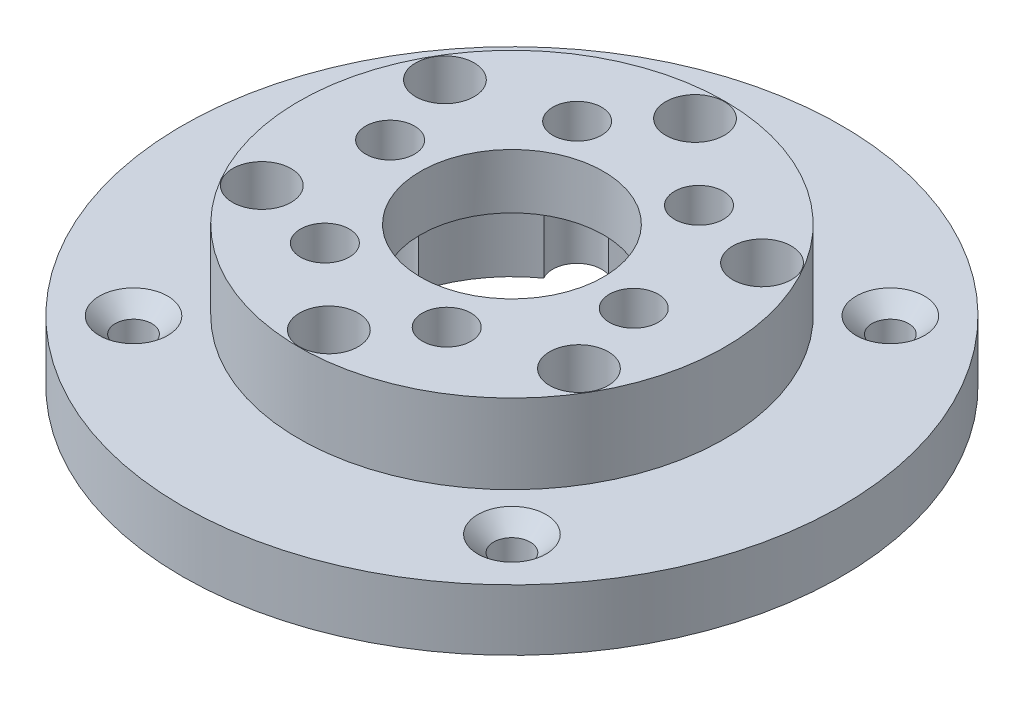
ISO-10303-21;
HEADER;
FILE_DESCRIPTION(('STEP AP214'),'2;1');
FILE_NAME('part.step','',(''),(''),'','','');
FILE_SCHEMA(('AUTOMOTIVE_DESIGN { 1 0 10303 214 1 1 1 1 }'));
ENDSEC;
DATA;
#1=APPLICATION_CONTEXT('core data for automotive mechanical design processes');
#2=APPLICATION_PROTOCOL_DEFINITION('international standard','automotive_design',2000,#1);
#3=PRODUCT_CONTEXT('',#1,'mechanical');
#4=PRODUCT('Part','Part','',(#3));
#5=PRODUCT_RELATED_PRODUCT_CATEGORY('part','',(#4));
#6=PRODUCT_DEFINITION_FORMATION('','',#4);
#7=PRODUCT_DEFINITION_CONTEXT('part definition',#1,'design');
#8=PRODUCT_DEFINITION('design','',#6,#7);
#9=PRODUCT_DEFINITION_SHAPE('','',#8);
#10=(LENGTH_UNIT() NAMED_UNIT(*) SI_UNIT(.MILLI.,.METRE.));
#11=(NAMED_UNIT(*) PLANE_ANGLE_UNIT() SI_UNIT($,.RADIAN.));
#12=(NAMED_UNIT(*) SI_UNIT($,.STERADIAN.) SOLID_ANGLE_UNIT());
#13=UNCERTAINTY_MEASURE_WITH_UNIT(LENGTH_MEASURE(1.E-05),#10,'distance_accuracy_value','');
#14=(GEOMETRIC_REPRESENTATION_CONTEXT(3) GLOBAL_UNCERTAINTY_ASSIGNED_CONTEXT((#13)) GLOBAL_UNIT_ASSIGNED_CONTEXT((#10,
#11,#12)) REPRESENTATION_CONTEXT('',''));
#15=CARTESIAN_POINT('',(0.,0.,0.));
#16=DIRECTION('',(0.,0.,1.));
#17=DIRECTION('',(1.,0.,0.));
#18=AXIS2_PLACEMENT_3D('',#15,#16,#17);
#19=CARTESIAN_POINT('',(0.,7.,0.));
#20=DIRECTION('',(0.,-1.,0.));
#21=DIRECTION('',(0.,0.,-1.));
#22=AXIS2_PLACEMENT_3D('',#19,#20,#21);
#23=CYLINDRICAL_SURFACE('',#22,11.);
#24=CARTESIAN_POINT('',(0.,7.,0.));
#25=DIRECTION('',(0.,-1.,0.));
#26=DIRECTION('',(0.,0.,-1.));
#27=AXIS2_PLACEMENT_3D('',#24,#25,#26);
#28=CIRCLE('',#27,11.);
#29=CARTESIAN_POINT('',(-7.84850425584507,7.,7.70720318572061));
#30=VERTEX_POINT('',#29);
#31=CARTESIAN_POINT('',(-10.9522024733718,7.,1.02433440939412));
#32=VERTEX_POINT('',#31);
#33=EDGE_CURVE('E173',#30,#32,#28,.T.);
#34=ORIENTED_EDGE('',*,*,#33,.F.);
#35=DIRECTION('',(0.,-1.,0.));
#36=VECTOR('',#35,1.);
#37=CARTESIAN_POINT('',(-7.84850425584507,3.5,7.7072031857206));
#38=LINE('',#37,#36);
#39=CARTESIAN_POINT('',(-7.84850425584507,0.,7.7072031857206));
#40=VERTEX_POINT('',#39);
#41=EDGE_CURVE('E251',#40,#30,#38,.F.);
#42=ORIENTED_EDGE('',*,*,#41,.F.);
#43=CARTESIAN_POINT('',(0.,0.,0.));
#44=DIRECTION('',(0.,-1.,0.));
#45=DIRECTION('',(0.,0.,-1.));
#46=AXIS2_PLACEMENT_3D('',#43,#44,#45);
#47=CIRCLE('',#46,11.);
#48=CARTESIAN_POINT('',(-10.9522024733718,0.,1.02433440939413));
#49=VERTEX_POINT('',#48);
#50=EDGE_CURVE('E185',#40,#49,#47,.T.);
#51=ORIENTED_EDGE('',*,*,#50,.T.);
#52=DIRECTION('',(0.,-1.,0.));
#53=VECTOR('',#52,1.);
#54=CARTESIAN_POINT('',(-10.9522024733718,3.5,1.02433440939413));
#55=LINE('',#54,#53);
#56=EDGE_CURVE('E265',#32,#49,#55,.T.);
#57=ORIENTED_EDGE('',*,*,#56,.F.);
#58=EDGE_LOOP('',(#34,#42,#51,#57));
#59=FACE_BOUND('',#58,.T.);
#60=ADVANCED_FACE('F41',(#59),#23,.F.);
#61=CARTESIAN_POINT('',(-10.5988858788847,7.,-2.94340247441283));
#62=VERTEX_POINT('',#61);
#63=CARTESIAN_POINT('',(-6.36320085719133,7.,-8.97271836463396));
#64=VERTEX_POINT('',#63);
#65=EDGE_CURVE('E170',#62,#64,#28,.T.);
#66=ORIENTED_EDGE('',*,*,#65,.F.);
#67=DIRECTION('',(0.,-1.,0.));
#68=VECTOR('',#67,1.);
#69=CARTESIAN_POINT('',(-10.5988858788846,3.5,-2.94340247441283));
#70=LINE('',#69,#68);
#71=CARTESIAN_POINT('',(-10.5988858788846,0.,-2.94340247441283));
#72=VERTEX_POINT('',#71);
#73=EDGE_CURVE('E65',#72,#62,#70,.F.);
#74=ORIENTED_EDGE('',*,*,#73,.F.);
#75=CARTESIAN_POINT('',(-6.36320085719133,0.,-8.97271836463396));
#76=VERTEX_POINT('',#75);
#77=EDGE_CURVE('E179',#72,#76,#47,.T.);
#78=ORIENTED_EDGE('',*,*,#77,.T.);
#79=DIRECTION('',(0.,-1.,0.));
#80=VECTOR('',#79,1.);
#81=CARTESIAN_POINT('',(-6.36320085719133,3.5,-8.97271836463396));
#82=LINE('',#81,#80);
#83=EDGE_CURVE('E274',#64,#76,#82,.T.);
#84=ORIENTED_EDGE('',*,*,#83,.F.);
#85=EDGE_LOOP('',(#66,#74,#78,#84));
#86=FACE_BOUND('',#85,.T.);
#87=ADVANCED_FACE('F314',(#86),#23,.F.);
#88=CARTESIAN_POINT('',(-2.75038162303873,7.,-10.6506056601327));
#89=VERTEX_POINT('',#88);
#90=CARTESIAN_POINT('',(4.58900161618082,7.,-9.99705277402744));
#91=VERTEX_POINT('',#90);
#92=EDGE_CURVE('E163',#89,#91,#28,.T.);
#93=ORIENTED_EDGE('',*,*,#92,.F.);
#94=DIRECTION('',(0.,-1.,0.));
#95=VECTOR('',#94,1.);
#96=CARTESIAN_POINT('',(-2.75038162303874,3.5,-10.6506056601327));
#97=LINE('',#96,#95);
#98=CARTESIAN_POINT('',(-2.75038162303874,0.,-10.6506056601327));
#99=VERTEX_POINT('',#98);
#100=EDGE_CURVE('E57',#99,#89,#97,.F.);
#101=ORIENTED_EDGE('',*,*,#100,.F.);
#102=CARTESIAN_POINT('',(4.58900161618082,0.,-9.99705277402744));
#103=VERTEX_POINT('',#102);
#104=EDGE_CURVE('E175',#99,#103,#47,.T.);
#105=ORIENTED_EDGE('',*,*,#104,.T.);
#106=DIRECTION('',(0.,-1.,0.));
#107=VECTOR('',#106,1.);
#108=CARTESIAN_POINT('',(4.58900161618082,3.5,-9.99705277402744));
#109=LINE('',#108,#107);
#110=EDGE_CURVE('E283',#91,#103,#109,.T.);
#111=ORIENTED_EDGE('',*,*,#110,.F.);
#112=EDGE_LOOP('',(#93,#101,#105,#111));
#113=FACE_BOUND('',#112,.T.);
#114=ADVANCED_FACE('F322',(#113),#23,.F.);
#115=CARTESIAN_POINT('',(7.84850425584522,7.,-7.70720318572045));
#116=VERTEX_POINT('',#115);
#117=CARTESIAN_POINT('',(10.9522024733719,7.,-1.02433440939342));
#118=VERTEX_POINT('',#117);
#119=EDGE_CURVE('E149',#116,#118,#28,.T.);
#120=ORIENTED_EDGE('',*,*,#119,.F.);
#121=DIRECTION('',(0.,-1.,0.));
#122=VECTOR('',#121,1.);
#123=CARTESIAN_POINT('',(7.84850425584522,3.5,-7.70720318572045));
#124=LINE('',#123,#122);
#125=CARTESIAN_POINT('',(7.84850425584522,0.,-7.70720318572045));
#126=VERTEX_POINT('',#125);
#127=EDGE_CURVE('E142',#126,#116,#124,.F.);
#128=ORIENTED_EDGE('',*,*,#127,.F.);
#129=CARTESIAN_POINT('',(10.9522024733719,0.,-1.02433440939342));
#130=VERTEX_POINT('',#129);
#131=EDGE_CURVE('E151',#126,#130,#47,.T.);
#132=ORIENTED_EDGE('',*,*,#131,.T.);
#133=DIRECTION('',(0.,-1.,0.));
#134=VECTOR('',#133,1.);
#135=CARTESIAN_POINT('',(10.9522024733719,3.5,-1.02433440939342));
#136=LINE('',#135,#134);
#137=EDGE_CURVE('E133',#118,#130,#136,.T.);
#138=ORIENTED_EDGE('',*,*,#137,.F.);
#139=EDGE_LOOP('',(#120,#128,#132,#138));
#140=FACE_BOUND('',#139,.T.);
#141=ADVANCED_FACE('F147',(#140),#23,.F.);
#142=CARTESIAN_POINT('',(10.5988858788852,7.,2.94340247441096));
#143=VERTEX_POINT('',#142);
#144=CARTESIAN_POINT('',(6.36320085719154,7.,8.97271836463381));
#145=VERTEX_POINT('',#144);
#146=EDGE_CURVE('E161',#143,#145,#28,.T.);
#147=ORIENTED_EDGE('',*,*,#146,.F.);
#148=DIRECTION('',(0.,-1.,0.));
#149=VECTOR('',#148,1.);
#150=CARTESIAN_POINT('',(10.5988858788852,3.5,2.94340247441096));
#151=LINE('',#150,#149);
#152=CARTESIAN_POINT('',(10.5988858788852,0.,2.94340247441096));
#153=VERTEX_POINT('',#152);
#154=EDGE_CURVE('E136',#153,#143,#151,.F.);
#155=ORIENTED_EDGE('',*,*,#154,.F.);
#156=CARTESIAN_POINT('',(6.36320085719154,0.,8.97271836463381));
#157=VERTEX_POINT('',#156);
#158=EDGE_CURVE('E174',#153,#157,#47,.T.);
#159=ORIENTED_EDGE('',*,*,#158,.T.);
#160=DIRECTION('',(0.,-1.,0.));
#161=VECTOR('',#160,1.);
#162=CARTESIAN_POINT('',(6.36320085719154,3.5,8.97271836463381));
#163=LINE('',#162,#161);
#164=EDGE_CURVE('E244',#145,#157,#163,.T.);
#165=ORIENTED_EDGE('',*,*,#164,.F.);
#166=EDGE_LOOP('',(#147,#155,#159,#165));
#167=FACE_BOUND('',#166,.T.);
#168=ADVANCED_FACE('F329',(#167),#23,.F.);
#169=CARTESIAN_POINT('',(0.,5.,0.));
#170=DIRECTION('',(0.,-1.,0.));
#171=DIRECTION('',(0.,0.,-1.));
#172=AXIS2_PLACEMENT_3D('',#169,#170,#171);
#173=CYLINDRICAL_SURFACE('',#172,27.);
#174=CARTESIAN_POINT('',(0.,5.,0.));
#175=DIRECTION('',(0.,1.,0.));
#176=DIRECTION('',(0.,0.,1.));
#177=AXIS2_PLACEMENT_3D('',#174,#175,#176);
#178=CIRCLE('',#177,27.);
#179=CARTESIAN_POINT('',(0.,5.,27.));
#180=VERTEX_POINT('',#179);
#181=EDGE_CURVE('E518',#180,#180,#178,.T.);
#182=ORIENTED_EDGE('',*,*,#181,.F.);
#183=EDGE_LOOP('',(#182));
#184=FACE_BOUND('',#183,.T.);
#185=CARTESIAN_POINT('',(0.,0.,0.));
#186=DIRECTION('',(0.,1.,0.));
#187=DIRECTION('',(0.,0.,1.));
#188=AXIS2_PLACEMENT_3D('',#185,#186,#187);
#189=CIRCLE('',#188,27.);
#190=CARTESIAN_POINT('',(0.,0.,27.));
#191=VERTEX_POINT('',#190);
#192=EDGE_CURVE('E165',#191,#191,#189,.T.);
#193=ORIENTED_EDGE('',*,*,#192,.T.);
#194=EDGE_LOOP('',(#193));
#195=FACE_BOUND('',#194,.T.);
#196=ADVANCED_FACE('F339',(#184,#195),#173,.T.);
#197=CARTESIAN_POINT('',(0.,5.,0.));
#198=DIRECTION('',(0.,1.,0.));
#199=DIRECTION('',(0.,0.,1.));
#200=AXIS2_PLACEMENT_3D('',#197,#198,#199);
#201=PLANE('',#200);
#202=CARTESIAN_POINT('',(15.5,5.,15.5));
#203=DIRECTION('',(0.,1.,0.));
#204=DIRECTION('',(0.,0.,1.));
#205=AXIS2_PLACEMENT_3D('',#202,#203,#204);
#206=CIRCLE('',#205,2.80000000000001);
#207=CARTESIAN_POINT('',(15.5,5.,18.3));
#208=VERTEX_POINT('',#207);
#209=EDGE_CURVE('E459',#208,#208,#206,.F.);
#210=ORIENTED_EDGE('',*,*,#209,.T.);
#211=EDGE_LOOP('',(#210));
#212=FACE_BOUND('',#211,.T.);
#213=CARTESIAN_POINT('',(15.5,5.,-15.5));
#214=DIRECTION('',(0.,1.,0.));
#215=DIRECTION('',(0.,0.,1.));
#216=AXIS2_PLACEMENT_3D('',#213,#214,#215);
#217=CIRCLE('',#216,2.79999999999999);
#218=CARTESIAN_POINT('',(15.5,5.,-12.7));
#219=VERTEX_POINT('',#218);
#220=EDGE_CURVE('E450',#219,#219,#217,.F.);
#221=ORIENTED_EDGE('',*,*,#220,.T.);
#222=EDGE_LOOP('',(#221));
#223=FACE_BOUND('',#222,.T.);
#224=CARTESIAN_POINT('',(-15.5,5.,-15.5));
#225=DIRECTION('',(0.,1.,0.));
#226=DIRECTION('',(0.,0.,1.));
#227=AXIS2_PLACEMENT_3D('',#224,#225,#226);
#228=CIRCLE('',#227,2.79999999999999);
#229=CARTESIAN_POINT('',(-15.5,5.,-12.7));
#230=VERTEX_POINT('',#229);
#231=EDGE_CURVE('E446',#230,#230,#228,.F.);
#232=ORIENTED_EDGE('',*,*,#231,.T.);
#233=EDGE_LOOP('',(#232));
#234=FACE_BOUND('',#233,.T.);
#235=CARTESIAN_POINT('',(-15.5,5.,15.5));
#236=DIRECTION('',(0.,1.,0.));
#237=DIRECTION('',(0.,0.,1.));
#238=AXIS2_PLACEMENT_3D('',#235,#236,#237);
#239=CIRCLE('',#238,2.80000000000001);
#240=CARTESIAN_POINT('',(-15.5,5.,18.3));
#241=VERTEX_POINT('',#240);
#242=EDGE_CURVE('E444',#241,#241,#239,.F.);
#243=ORIENTED_EDGE('',*,*,#242,.T.);
#244=EDGE_LOOP('',(#243));
#245=FACE_BOUND('',#244,.T.);
#246=CARTESIAN_POINT('',(0.,5.,0.));
#247=DIRECTION('',(0.,1.,0.));
#248=DIRECTION('',(0.,0.,1.));
#249=AXIS2_PLACEMENT_3D('',#246,#247,#248);
#250=CIRCLE('',#249,17.45);
#251=CARTESIAN_POINT('',(0.,5.,-17.45));
#252=VERTEX_POINT('',#251);
#253=EDGE_CURVE('E453',#252,#252,#250,.T.);
#254=ORIENTED_EDGE('',*,*,#253,.F.);
#255=EDGE_LOOP('',(#254));
#256=FACE_BOUND('',#255,.T.);
#257=ORIENTED_EDGE('',*,*,#181,.T.);
#258=EDGE_LOOP('',(#257));
#259=FACE_BOUND('',#258,.T.);
#260=ADVANCED_FACE('F346',(#212,#223,#234,#245,#256,#259),#201,.T.);
#261=CARTESIAN_POINT('',(0.,0.,0.));
#262=DIRECTION('',(0.,1.,0.));
#263=DIRECTION('',(0.,0.,1.));
#264=AXIS2_PLACEMENT_3D('',#261,#262,#263);
#265=PLANE('',#264);
#266=CARTESIAN_POINT('',(0.,0.,-15.));
#267=DIRECTION('',(0.,1.,0.));
#268=DIRECTION('',(0.,0.,1.));
#269=AXIS2_PLACEMENT_3D('',#266,#267,#268);
#270=CIRCLE('',#269,2.4);
#271=CARTESIAN_POINT('',(0.,0.,-12.6));
#272=VERTEX_POINT('',#271);
#273=EDGE_CURVE('E203',#272,#272,#270,.T.);
#274=ORIENTED_EDGE('',*,*,#273,.T.);
#275=EDGE_LOOP('',(#274));
#276=FACE_BOUND('',#275,.T.);
#277=CARTESIAN_POINT('',(-12.9903810567665,0.,-7.50000000000015));
#278=DIRECTION('',(0.,1.,0.));
#279=DIRECTION('',(0.,0.,1.));
#280=AXIS2_PLACEMENT_3D('',#277,#278,#279);
#281=CIRCLE('',#280,2.4);
#282=CARTESIAN_POINT('',(-12.9903810567665,0.,-5.10000000000015));
#283=VERTEX_POINT('',#282);
#284=EDGE_CURVE('E206',#283,#283,#281,.T.);
#285=ORIENTED_EDGE('',*,*,#284,.T.);
#286=EDGE_LOOP('',(#285));
#287=FACE_BOUND('',#286,.T.);
#288=CARTESIAN_POINT('',(-12.9903810567667,0.,7.49999999999988));
#289=DIRECTION('',(0.,1.,0.));
#290=DIRECTION('',(0.,0.,1.));
#291=AXIS2_PLACEMENT_3D('',#288,#289,#290);
#292=CIRCLE('',#291,2.4);
#293=CARTESIAN_POINT('',(-12.9903810567667,0.,9.89999999999988));
#294=VERTEX_POINT('',#293);
#295=EDGE_CURVE('E209',#294,#294,#292,.T.);
#296=ORIENTED_EDGE('',*,*,#295,.T.);
#297=EDGE_LOOP('',(#296));
#298=FACE_BOUND('',#297,.T.);
#299=CARTESIAN_POINT('',(-1.04744440165294E-13,0.,15.));
#300=DIRECTION('',(0.,1.,0.));
#301=DIRECTION('',(0.,0.,1.));
#302=AXIS2_PLACEMENT_3D('',#299,#300,#301);
#303=CIRCLE('',#302,2.4);
#304=CARTESIAN_POINT('',(-1.04744440165294E-13,0.,17.4));
#305=VERTEX_POINT('',#304);
#306=EDGE_CURVE('E212',#305,#305,#303,.T.);
#307=ORIENTED_EDGE('',*,*,#306,.T.);
#308=EDGE_LOOP('',(#307));
#309=FACE_BOUND('',#308,.T.);
#310=CARTESIAN_POINT('',(12.9903810567665,0.,7.50000000000006));
#311=DIRECTION('',(0.,1.,0.));
#312=DIRECTION('',(0.,0.,1.));
#313=AXIS2_PLACEMENT_3D('',#310,#311,#312);
#314=CIRCLE('',#313,2.4);
#315=CARTESIAN_POINT('',(12.9903810567665,0.,9.90000000000006));
#316=VERTEX_POINT('',#315);
#317=EDGE_CURVE('E215',#316,#316,#314,.T.);
#318=ORIENTED_EDGE('',*,*,#317,.T.);
#319=EDGE_LOOP('',(#318));
#320=FACE_BOUND('',#319,.T.);
#321=CARTESIAN_POINT('',(12.9903810567666,0.,-7.49999999999997));
#322=DIRECTION('',(0.,1.,0.));
#323=DIRECTION('',(0.,0.,1.));
#324=AXIS2_PLACEMENT_3D('',#321,#322,#323);
#325=CIRCLE('',#324,2.4);
#326=CARTESIAN_POINT('',(12.9903810567666,0.,-5.09999999999997));
#327=VERTEX_POINT('',#326);
#328=EDGE_CURVE('E218',#327,#327,#325,.T.);
#329=ORIENTED_EDGE('',*,*,#328,.T.);
#330=EDGE_LOOP('',(#329));
#331=FACE_BOUND('',#330,.T.);
#332=CARTESIAN_POINT('',(-15.5,0.,-15.5));
#333=DIRECTION('',(0.,-1.,0.));
#334=DIRECTION('',(0.,0.,-1.));
#335=AXIS2_PLACEMENT_3D('',#332,#333,#334);
#336=CIRCLE('',#335,1.5);
#337=CARTESIAN_POINT('',(-15.5,0.,-17.));
#338=VERTEX_POINT('',#337);
#339=EDGE_CURVE('E194',#338,#338,#336,.T.);
#340=ORIENTED_EDGE('',*,*,#339,.F.);
#341=EDGE_LOOP('',(#340));
#342=FACE_BOUND('',#341,.T.);
#343=CARTESIAN_POINT('',(15.5,0.,-15.5));
#344=DIRECTION('',(0.,-1.,0.));
#345=DIRECTION('',(0.,0.,-1.));
#346=AXIS2_PLACEMENT_3D('',#343,#344,#345);
#347=CIRCLE('',#346,1.5);
#348=CARTESIAN_POINT('',(15.5,0.,-17.));
#349=VERTEX_POINT('',#348);
#350=EDGE_CURVE('E191',#349,#349,#347,.T.);
#351=ORIENTED_EDGE('',*,*,#350,.F.);
#352=EDGE_LOOP('',(#351));
#353=FACE_BOUND('',#352,.T.);
#354=CARTESIAN_POINT('',(15.5,0.,15.5));
#355=DIRECTION('',(0.,-1.,0.));
#356=DIRECTION('',(0.,0.,-1.));
#357=AXIS2_PLACEMENT_3D('',#354,#355,#356);
#358=CIRCLE('',#357,1.5);
#359=CARTESIAN_POINT('',(15.5,0.,14.));
#360=VERTEX_POINT('',#359);
#361=EDGE_CURVE('E187',#360,#360,#358,.T.);
#362=ORIENTED_EDGE('',*,*,#361,.F.);
#363=EDGE_LOOP('',(#362));
#364=FACE_BOUND('',#363,.T.);
#365=CARTESIAN_POINT('',(-15.5,0.,15.5));
#366=DIRECTION('',(0.,-1.,0.));
#367=DIRECTION('',(0.,0.,-1.));
#368=AXIS2_PLACEMENT_3D('',#365,#366,#367);
#369=CIRCLE('',#368,1.5);
#370=CARTESIAN_POINT('',(-15.5,0.,14.));
#371=VERTEX_POINT('',#370);
#372=EDGE_CURVE('E180',#371,#371,#369,.T.);
#373=ORIENTED_EDGE('',*,*,#372,.F.);
#374=EDGE_LOOP('',(#373));
#375=FACE_BOUND('',#374,.T.);
#376=ORIENTED_EDGE('',*,*,#50,.F.);
#377=CARTESIAN_POINT('',(-6.3232697920794,0.,9.00090324003946));
#378=DIRECTION('',(0.,-1.,0.));
#379=DIRECTION('',(0.,0.,-1.));
#380=AXIS2_PLACEMENT_3D('',#377,#378,#379);
#381=CIRCLE('',#380,2.00000000000079);
#382=CARTESIAN_POINT('',(-4.58900161617989,0.,9.99705277402787));
#383=VERTEX_POINT('',#382);
#384=EDGE_CURVE('E257',#383,#40,#381,.T.);
#385=ORIENTED_EDGE('',*,*,#384,.F.);
#386=CARTESIAN_POINT('',(2.75038162304087,0.,10.6506056601322));
#387=VERTEX_POINT('',#386);
#388=EDGE_CURVE('E177',#387,#383,#47,.T.);
#389=ORIENTED_EDGE('',*,*,#388,.F.);
#390=CARTESIAN_POINT('',(4.63337596684063,0.,9.97656389494358));
#391=DIRECTION('',(0.,-1.,0.));
#392=DIRECTION('',(0.,0.,-1.));
#393=AXIS2_PLACEMENT_3D('',#390,#391,#392);
#394=CIRCLE('',#393,2.00000000000011);
#395=EDGE_CURVE('E243',#157,#387,#394,.T.);
#396=ORIENTED_EDGE('',*,*,#395,.F.);
#397=ORIENTED_EDGE('',*,*,#158,.F.);
#398=CARTESIAN_POINT('',(10.9566457589206,0.,0.975660654903872));
#399=DIRECTION('',(0.,-1.,0.));
#400=DIRECTION('',(0.,0.,-1.));
#401=AXIS2_PLACEMENT_3D('',#398,#399,#400);
#402=CIRCLE('',#401,2.);
#403=EDGE_CURVE('E141',#130,#153,#402,.T.);
#404=ORIENTED_EDGE('',*,*,#403,.F.);
#405=ORIENTED_EDGE('',*,*,#131,.F.);
#406=CARTESIAN_POINT('',(6.32326979208052,0.,-9.00090324003997));
#407=DIRECTION('',(0.,-1.,0.));
#408=DIRECTION('',(0.,0.,-1.));
#409=AXIS2_PLACEMENT_3D('',#406,#407,#408);
#410=CIRCLE('',#409,2.00000000000048);
#411=EDGE_CURVE('E286',#103,#126,#410,.T.);
#412=ORIENTED_EDGE('',*,*,#411,.F.);
#413=ORIENTED_EDGE('',*,*,#104,.F.);
#414=CARTESIAN_POINT('',(-4.63337596683952,0.,-9.97656389494411));
#415=DIRECTION('',(0.,-1.,0.));
#416=DIRECTION('',(0.,0.,-1.));
#417=AXIS2_PLACEMENT_3D('',#414,#415,#416);
#418=CIRCLE('',#417,2.00000000000108);
#419=EDGE_CURVE('E277',#76,#99,#418,.T.);
#420=ORIENTED_EDGE('',*,*,#419,.F.);
#421=ORIENTED_EDGE('',*,*,#77,.F.);
#422=CARTESIAN_POINT('',(-10.9566457589195,0.,-0.975660654904396));
#423=DIRECTION('',(0.,-1.,0.));
#424=DIRECTION('',(0.,0.,-1.));
#425=AXIS2_PLACEMENT_3D('',#422,#423,#424);
#426=CIRCLE('',#425,2.00000000000123);
#427=EDGE_CURVE('E268',#49,#72,#426,.T.);
#428=ORIENTED_EDGE('',*,*,#427,.F.);
#429=EDGE_LOOP('',(#376,#385,#389,#396,#397,#404,#405,#412,#413,#420,#421,#428));
#430=FACE_BOUND('',#429,.T.);
#431=ORIENTED_EDGE('',*,*,#192,.F.);
#432=EDGE_LOOP('',(#431));
#433=FACE_BOUND('',#432,.T.);
#434=ADVANCED_FACE('F367',(#276,#287,#298,#309,#320,#331,#342,#353,#364,#375,#430,#433),#265,.F.);
#435=CARTESIAN_POINT('',(0.,11.5,0.));
#436=DIRECTION('',(0.,-1.,0.));
#437=DIRECTION('',(0.,0.,-1.));
#438=AXIS2_PLACEMENT_3D('',#435,#436,#437);
#439=CYLINDRICAL_SURFACE('',#438,17.45);
#440=CARTESIAN_POINT('',(0.,11.5,0.));
#441=DIRECTION('',(0.,1.,0.));
#442=DIRECTION('',(0.,0.,1.));
#443=AXIS2_PLACEMENT_3D('',#440,#441,#442);
#444=CIRCLE('',#443,17.45);
#445=CARTESIAN_POINT('',(0.,11.5,-17.45));
#446=VERTEX_POINT('',#445);
#447=EDGE_CURVE('E160',#446,#446,#444,.T.);
#448=CARTESIAN_POINT('',(0.,11.5,-17.45));
#449=CARTESIAN_POINT('',(0.,11.4322916666667,-17.45));
#450=CARTESIAN_POINT('',(0.,11.3645833333333,-17.45));
#451=CARTESIAN_POINT('',(0.,11.2291666666667,-17.45));
#452=CARTESIAN_POINT('',(0.,11.1614583333333,-17.45));
#453=CARTESIAN_POINT('',(0.,11.0260416666667,-17.45));
#454=CARTESIAN_POINT('',(0.,10.9583333333333,-17.45));
#455=CARTESIAN_POINT('',(0.,10.8229166666667,-17.45));
#456=CARTESIAN_POINT('',(0.,10.7552083333333,-17.45));
#457=CARTESIAN_POINT('',(0.,10.6197916666667,-17.45));
#458=CARTESIAN_POINT('',(0.,10.5520833333333,-17.45));
#459=CARTESIAN_POINT('',(0.,10.4166666666667,-17.45));
#460=CARTESIAN_POINT('',(0.,10.3489583333333,-17.45));
#461=CARTESIAN_POINT('',(0.,10.2135416666667,-17.45));
#462=CARTESIAN_POINT('',(0.,10.1458333333333,-17.45));
#463=CARTESIAN_POINT('',(0.,10.0104166666667,-17.45));
#464=CARTESIAN_POINT('',(0.,9.94270833333333,-17.45));
#465=CARTESIAN_POINT('',(0.,9.80729166666667,-17.45));
#466=CARTESIAN_POINT('',(0.,9.73958333333333,-17.45));
#467=CARTESIAN_POINT('',(0.,9.60416666666667,-17.45));
#468=CARTESIAN_POINT('',(0.,9.53645833333333,-17.45));
#469=CARTESIAN_POINT('',(0.,9.40104166666667,-17.45));
#470=CARTESIAN_POINT('',(0.,9.33333333333333,-17.45));
#471=CARTESIAN_POINT('',(0.,9.19791666666667,-17.45));
#472=CARTESIAN_POINT('',(0.,9.13020833333333,-17.45));
#473=CARTESIAN_POINT('',(0.,8.99479166666667,-17.45));
#474=CARTESIAN_POINT('',(0.,8.92708333333333,-17.45));
#475=CARTESIAN_POINT('',(0.,8.79166666666667,-17.45));
#476=CARTESIAN_POINT('',(0.,8.72395833333333,-17.45));
#477=CARTESIAN_POINT('',(0.,8.58854166666667,-17.45));
#478=CARTESIAN_POINT('',(0.,8.52083333333333,-17.45));
#479=CARTESIAN_POINT('',(0.,8.38541666666667,-17.45));
#480=CARTESIAN_POINT('',(0.,8.31770833333333,-17.45));
#481=CARTESIAN_POINT('',(0.,8.18229166666667,-17.45));
#482=CARTESIAN_POINT('',(0.,8.11458333333333,-17.45));
#483=CARTESIAN_POINT('',(0.,7.97916666666667,-17.45));
#484=CARTESIAN_POINT('',(0.,7.91145833333333,-17.45));
#485=CARTESIAN_POINT('',(0.,7.77604166666667,-17.45));
#486=CARTESIAN_POINT('',(0.,7.70833333333333,-17.45));
#487=CARTESIAN_POINT('',(0.,7.57291666666667,-17.45));
#488=CARTESIAN_POINT('',(0.,7.50520833333333,-17.45));
#489=CARTESIAN_POINT('',(0.,7.36979166666667,-17.45));
#490=CARTESIAN_POINT('',(0.,7.30208333333333,-17.45));
#491=CARTESIAN_POINT('',(0.,7.16666666666667,-17.45));
#492=CARTESIAN_POINT('',(0.,7.09895833333333,-17.45));
#493=CARTESIAN_POINT('',(0.,6.96354166666667,-17.45));
#494=CARTESIAN_POINT('',(0.,6.89583333333333,-17.45));
#495=CARTESIAN_POINT('',(0.,6.76041666666667,-17.45));
#496=CARTESIAN_POINT('',(0.,6.69270833333333,-17.45));
#497=CARTESIAN_POINT('',(0.,6.55729166666667,-17.45));
#498=CARTESIAN_POINT('',(0.,6.48958333333333,-17.45));
#499=CARTESIAN_POINT('',(0.,6.35416666666667,-17.45));
#500=CARTESIAN_POINT('',(0.,6.28645833333333,-17.45));
#501=CARTESIAN_POINT('',(0.,6.15104166666667,-17.45));
#502=CARTESIAN_POINT('',(0.,6.08333333333333,-17.45));
#503=CARTESIAN_POINT('',(0.,5.94791666666667,-17.45));
#504=CARTESIAN_POINT('',(0.,5.88020833333333,-17.45));
#505=CARTESIAN_POINT('',(0.,5.74479166666667,-17.45));
#506=CARTESIAN_POINT('',(0.,5.67708333333333,-17.45));
#507=CARTESIAN_POINT('',(0.,5.54166666666667,-17.45));
#508=CARTESIAN_POINT('',(0.,5.47395833333333,-17.45));
#509=CARTESIAN_POINT('',(0.,5.33854166666667,-17.45));
#510=CARTESIAN_POINT('',(0.,5.27083333333333,-17.45));
#511=CARTESIAN_POINT('',(0.,5.13541666666667,-17.45));
#512=CARTESIAN_POINT('',(0.,5.06770833333333,-17.45));
#513=CARTESIAN_POINT('',(0.,5.,-17.45));
#514=B_SPLINE_CURVE_WITH_KNOTS('',3,(#448,#449,#450,#451,#452,#453,#454,#455,#456,#457,#458,
#459,#460,#461,#462,#463,#464,#465,#466,#467,#468,#469,#470,#471,#472,#473,#474,#475,#476,#477,
#478,#479,#480,#481,#482,#483,#484,#485,#486,#487,#488,#489,#490,#491,#492,#493,#494,#495,#496,
#497,#498,#499,#500,#501,#502,#503,#504,#505,#506,#507,#508,#509,#510,#511,#512,#513),
.UNSPECIFIED.,.F.,.F.,(4,2,2,2,2,2,2,2,2,2,2,2,2,2,2,2,2,2,2,2,2,2,2,2,2,2,2,2,2,2,2,2,4),(0.,
0.203124999999998,0.406249999999999,0.609374999999999,0.812499999999999,1.015625,1.21875,
1.421875,1.625,1.828125,2.03125,2.234375,2.4375,2.640625,2.84375,3.046875,3.25,3.453125,3.65625,
3.859375,4.0625,4.265625,4.46875,4.671875,4.875,5.078125,5.28125,5.484375,5.6875,5.890625,
6.09375,6.296875,6.5),.UNSPECIFIED.);
#515=EDGE_CURVE('BSEAM335',#446,#252,#514,.T.);
#516=ORIENTED_EDGE('',*,*,#447,.F.);
#517=ORIENTED_EDGE('',*,*,#253,.T.);
#518=ORIENTED_EDGE('',*,*,#515,.T.);
#519=ORIENTED_EDGE('',*,*,#515,.F.);
#520=EDGE_LOOP('',(#516,#518,#517,#519));
#521=FACE_BOUND('',#520,.T.);
#522=ADVANCED_FACE('F335',(#521),#439,.T.);
#523=CARTESIAN_POINT('',(0.,11.5,0.));
#524=DIRECTION('',(0.,1.,0.));
#525=DIRECTION('',(0.,0.,1.));
#526=AXIS2_PLACEMENT_3D('',#523,#524,#525);
#527=PLANE('',#526);
#528=CARTESIAN_POINT('',(-6.3232697920794,11.5,9.00090324003946));
#529=DIRECTION('',(0.,1.,0.));
#530=DIRECTION('',(0.,0.,1.));
#531=AXIS2_PLACEMENT_3D('',#528,#529,#530);
#532=CIRCLE('',#531,2.00000000000079);
#533=CARTESIAN_POINT('',(-6.3232697920794,11.5,11.0009032400402));
#534=VERTEX_POINT('',#533);
#535=EDGE_CURVE('E256',#534,#534,#532,.F.);
#536=ORIENTED_EDGE('',*,*,#535,.T.);
#537=EDGE_LOOP('',(#536));
#538=FACE_BOUND('',#537,.T.);
#539=CARTESIAN_POINT('',(-10.9566457589195,11.5,-0.975660654904396));
#540=DIRECTION('',(0.,1.,0.));
#541=DIRECTION('',(0.,0.,1.));
#542=AXIS2_PLACEMENT_3D('',#539,#540,#541);
#543=CIRCLE('',#542,2.00000000000123);
#544=CARTESIAN_POINT('',(-10.9566457589195,11.5,1.02433934509683));
#545=VERTEX_POINT('',#544);
#546=EDGE_CURVE('E267',#545,#545,#543,.F.);
#547=ORIENTED_EDGE('',*,*,#546,.T.);
#548=EDGE_LOOP('',(#547));
#549=FACE_BOUND('',#548,.T.);
#550=CARTESIAN_POINT('',(-4.63337596683952,11.5,-9.97656389494411));
#551=DIRECTION('',(0.,1.,0.));
#552=DIRECTION('',(0.,0.,1.));
#553=AXIS2_PLACEMENT_3D('',#550,#551,#552);
#554=CIRCLE('',#553,2.00000000000108);
#555=CARTESIAN_POINT('',(-4.63337596683952,11.5,-7.97656389494303));
#556=VERTEX_POINT('',#555);
#557=EDGE_CURVE('E276',#556,#556,#554,.F.);
#558=ORIENTED_EDGE('',*,*,#557,.T.);
#559=EDGE_LOOP('',(#558));
#560=FACE_BOUND('',#559,.T.);
#561=CARTESIAN_POINT('',(6.32326979208052,11.5,-9.00090324003997));
#562=DIRECTION('',(0.,1.,0.));
#563=DIRECTION('',(0.,0.,1.));
#564=AXIS2_PLACEMENT_3D('',#561,#562,#563);
#565=CIRCLE('',#564,2.00000000000048);
#566=CARTESIAN_POINT('',(6.32326979208052,11.5,-7.00090324003949));
#567=VERTEX_POINT('',#566);
#568=EDGE_CURVE('E285',#567,#567,#565,.F.);
#569=ORIENTED_EDGE('',*,*,#568,.T.);
#570=EDGE_LOOP('',(#569));
#571=FACE_BOUND('',#570,.T.);
#572=CARTESIAN_POINT('',(10.9566457589206,11.5,0.975660654903872));
#573=DIRECTION('',(0.,1.,0.));
#574=DIRECTION('',(0.,0.,1.));
#575=AXIS2_PLACEMENT_3D('',#572,#573,#574);
#576=CIRCLE('',#575,2.);
#577=CARTESIAN_POINT('',(10.9566457589206,11.5,2.97566065490387));
#578=VERTEX_POINT('',#577);
#579=EDGE_CURVE('E152',#578,#578,#576,.F.);
#580=ORIENTED_EDGE('',*,*,#579,.T.);
#581=EDGE_LOOP('',(#580));
#582=FACE_BOUND('',#581,.T.);
#583=CARTESIAN_POINT('',(4.63337596684063,11.5,9.97656389494358));
#584=DIRECTION('',(0.,1.,0.));
#585=DIRECTION('',(0.,0.,1.));
#586=AXIS2_PLACEMENT_3D('',#583,#584,#585);
#587=CIRCLE('',#586,2.00000000000011);
#588=CARTESIAN_POINT('',(4.63337596684063,11.5,11.9765638949437));
#589=VERTEX_POINT('',#588);
#590=EDGE_CURVE('E240',#589,#589,#587,.F.);
#591=ORIENTED_EDGE('',*,*,#590,.T.);
#592=EDGE_LOOP('',(#591));
#593=FACE_BOUND('',#592,.T.);
#594=CARTESIAN_POINT('',(0.,11.5,-15.));
#595=DIRECTION('',(0.,1.,0.));
#596=DIRECTION('',(0.,0.,1.));
#597=AXIS2_PLACEMENT_3D('',#594,#595,#596);
#598=CIRCLE('',#597,2.4);
#599=CARTESIAN_POINT('',(0.,11.5,-12.6));
#600=VERTEX_POINT('',#599);
#601=EDGE_CURVE('E221',#600,#600,#598,.T.);
#602=ORIENTED_EDGE('',*,*,#601,.F.);
#603=EDGE_LOOP('',(#602));
#604=FACE_BOUND('',#603,.T.);
#605=CARTESIAN_POINT('',(-12.9903810567665,11.5,-7.50000000000015));
#606=DIRECTION('',(0.,1.,0.));
#607=DIRECTION('',(0.,0.,1.));
#608=AXIS2_PLACEMENT_3D('',#605,#606,#607);
#609=CIRCLE('',#608,2.4);
#610=CARTESIAN_POINT('',(-12.9903810567665,11.5,-5.10000000000015));
#611=VERTEX_POINT('',#610);
#612=EDGE_CURVE('E226',#611,#611,#609,.T.);
#613=ORIENTED_EDGE('',*,*,#612,.F.);
#614=EDGE_LOOP('',(#613));
#615=FACE_BOUND('',#614,.T.);
#616=CARTESIAN_POINT('',(-12.9903810567667,11.5,7.49999999999988));
#617=DIRECTION('',(0.,1.,0.));
#618=DIRECTION('',(0.,0.,1.));
#619=AXIS2_PLACEMENT_3D('',#616,#617,#618);
#620=CIRCLE('',#619,2.4);
#621=CARTESIAN_POINT('',(-12.9903810567667,11.5,9.89999999999988));
#622=VERTEX_POINT('',#621);
#623=EDGE_CURVE('E222',#622,#622,#620,.T.);
#624=ORIENTED_EDGE('',*,*,#623,.F.);
#625=EDGE_LOOP('',(#624));
#626=FACE_BOUND('',#625,.T.);
#627=CARTESIAN_POINT('',(-1.04744440165294E-13,11.5,15.));
#628=DIRECTION('',(0.,1.,0.));
#629=DIRECTION('',(0.,0.,1.));
#630=AXIS2_PLACEMENT_3D('',#627,#628,#629);
#631=CIRCLE('',#630,2.4);
#632=CARTESIAN_POINT('',(-1.04744440165294E-13,11.5,17.4));
#633=VERTEX_POINT('',#632);
#634=EDGE_CURVE('E225',#633,#633,#631,.T.);
#635=ORIENTED_EDGE('',*,*,#634,.F.);
#636=EDGE_LOOP('',(#635));
#637=FACE_BOUND('',#636,.T.);
#638=CARTESIAN_POINT('',(12.9903810567665,11.5,7.50000000000006));
#639=DIRECTION('',(0.,1.,0.));
#640=DIRECTION('',(0.,0.,1.));
#641=AXIS2_PLACEMENT_3D('',#638,#639,#640);
#642=CIRCLE('',#641,2.4);
#643=CARTESIAN_POINT('',(12.9903810567665,11.5,9.90000000000006));
#644=VERTEX_POINT('',#643);
#645=EDGE_CURVE('E229',#644,#644,#642,.T.);
#646=ORIENTED_EDGE('',*,*,#645,.F.);
#647=EDGE_LOOP('',(#646));
#648=FACE_BOUND('',#647,.T.);
#649=CARTESIAN_POINT('',(12.9903810567666,11.5,-7.49999999999997));
#650=DIRECTION('',(0.,1.,0.));
#651=DIRECTION('',(0.,0.,1.));
#652=AXIS2_PLACEMENT_3D('',#649,#650,#651);
#653=CIRCLE('',#652,2.4);
#654=CARTESIAN_POINT('',(12.9903810567666,11.5,-5.09999999999997));
#655=VERTEX_POINT('',#654);
#656=EDGE_CURVE('E232',#655,#655,#653,.T.);
#657=ORIENTED_EDGE('',*,*,#656,.F.);
#658=EDGE_LOOP('',(#657));
#659=FACE_BOUND('',#658,.T.);
#660=CARTESIAN_POINT('',(0.,11.5,0.));
#661=DIRECTION('',(0.,1.,0.));
#662=DIRECTION('',(0.,0.,1.));
#663=AXIS2_PLACEMENT_3D('',#660,#661,#662);
#664=CIRCLE('',#663,7.5);
#665=CARTESIAN_POINT('',(0.,11.5,7.5));
#666=VERTEX_POINT('',#665);
#667=EDGE_CURVE('E200',#666,#666,#664,.T.);
#668=ORIENTED_EDGE('',*,*,#667,.F.);
#669=EDGE_LOOP('',(#668));
#670=FACE_BOUND('',#669,.T.);
#671=ORIENTED_EDGE('',*,*,#447,.T.);
#672=EDGE_LOOP('',(#671));
#673=FACE_BOUND('',#672,.T.);
#674=ADVANCED_FACE('F296',(#538,#549,#560,#571,#582,#593,#604,#615,#626,#637,#648,#659,#670,
#673),#527,.T.);
#675=ORIENTED_EDGE('',*,*,#388,.T.);
#676=DIRECTION('',(0.,-1.,0.));
#677=VECTOR('',#676,1.);
#678=CARTESIAN_POINT('',(-4.58900161617989,3.5,9.99705277402787));
#679=LINE('',#678,#677);
#680=CARTESIAN_POINT('',(-4.58900161617989,7.,9.99705277402787));
#681=VERTEX_POINT('',#680);
#682=EDGE_CURVE('E254',#681,#383,#679,.T.);
#683=ORIENTED_EDGE('',*,*,#682,.F.);
#684=CARTESIAN_POINT('',(2.75038162304087,7.,10.6506056601322));
#685=VERTEX_POINT('',#684);
#686=EDGE_CURVE('E167',#685,#681,#28,.T.);
#687=ORIENTED_EDGE('',*,*,#686,.F.);
#688=DIRECTION('',(0.,-1.,0.));
#689=VECTOR('',#688,1.);
#690=CARTESIAN_POINT('',(2.75038162304087,3.5,10.6506056601322));
#691=LINE('',#690,#689);
#692=EDGE_CURVE('E249',#387,#685,#691,.F.);
#693=ORIENTED_EDGE('',*,*,#692,.F.);
#694=EDGE_LOOP('',(#675,#683,#687,#693));
#695=FACE_BOUND('',#694,.T.);
#696=ADVANCED_FACE('F317',(#695),#23,.F.);
#697=CARTESIAN_POINT('',(0.,7.,0.));
#698=DIRECTION('',(0.,-1.,0.));
#699=DIRECTION('',(0.,0.,-1.));
#700=AXIS2_PLACEMENT_3D('',#697,#698,#699);
#701=PLANE('',#700);
#702=CARTESIAN_POINT('',(-6.3232697920794,7.,9.00090324003946));
#703=DIRECTION('',(0.,-1.,0.));
#704=DIRECTION('',(0.,0.,-1.));
#705=AXIS2_PLACEMENT_3D('',#702,#703,#704);
#706=CIRCLE('',#705,2.00000000000079);
#707=EDGE_CURVE('E259',#681,#30,#706,.F.);
#708=ORIENTED_EDGE('',*,*,#707,.T.);
#709=ORIENTED_EDGE('',*,*,#33,.T.);
#710=CARTESIAN_POINT('',(-10.9566457589195,7.,-0.975660654904396));
#711=DIRECTION('',(0.,-1.,0.));
#712=DIRECTION('',(0.,0.,-1.));
#713=AXIS2_PLACEMENT_3D('',#710,#711,#712);
#714=CIRCLE('',#713,2.00000000000123);
#715=EDGE_CURVE('E253',#32,#62,#714,.F.);
#716=ORIENTED_EDGE('',*,*,#715,.T.);
#717=ORIENTED_EDGE('',*,*,#65,.T.);
#718=CARTESIAN_POINT('',(-4.63337596683952,7.,-9.97656389494411));
#719=DIRECTION('',(0.,-1.,0.));
#720=DIRECTION('',(0.,0.,-1.));
#721=AXIS2_PLACEMENT_3D('',#718,#719,#720);
#722=CIRCLE('',#721,2.00000000000108);
#723=EDGE_CURVE('E264',#64,#89,#722,.F.);
#724=ORIENTED_EDGE('',*,*,#723,.T.);
#725=ORIENTED_EDGE('',*,*,#92,.T.);
#726=CARTESIAN_POINT('',(6.32326979208052,7.,-9.00090324003997));
#727=DIRECTION('',(0.,-1.,0.));
#728=DIRECTION('',(0.,0.,-1.));
#729=AXIS2_PLACEMENT_3D('',#726,#727,#728);
#730=CIRCLE('',#729,2.00000000000048);
#731=EDGE_CURVE('E159',#91,#116,#730,.F.);
#732=ORIENTED_EDGE('',*,*,#731,.T.);
#733=ORIENTED_EDGE('',*,*,#119,.T.);
#734=CARTESIAN_POINT('',(10.9566457589206,7.,0.975660654903872));
#735=DIRECTION('',(0.,-1.,0.));
#736=DIRECTION('',(0.,0.,-1.));
#737=AXIS2_PLACEMENT_3D('',#734,#735,#736);
#738=CIRCLE('',#737,2.);
#739=EDGE_CURVE('E130',#118,#143,#738,.F.);
#740=ORIENTED_EDGE('',*,*,#739,.T.);
#741=ORIENTED_EDGE('',*,*,#146,.T.);
#742=CARTESIAN_POINT('',(4.63337596684063,7.,9.97656389494358));
#743=DIRECTION('',(0.,-1.,0.));
#744=DIRECTION('',(0.,0.,-1.));
#745=AXIS2_PLACEMENT_3D('',#742,#743,#744);
#746=CIRCLE('',#745,2.00000000000011);
#747=EDGE_CURVE('E237',#145,#685,#746,.F.);
#748=ORIENTED_EDGE('',*,*,#747,.T.);
#749=ORIENTED_EDGE('',*,*,#686,.T.);
#750=EDGE_LOOP('',(#708,#709,#716,#717,#724,#725,#732,#733,#740,#741,#748,#749));
#751=FACE_BOUND('',#750,.T.);
#752=CARTESIAN_POINT('',(0.,7.,0.));
#753=DIRECTION('',(0.,-1.,0.));
#754=DIRECTION('',(0.,0.,-1.));
#755=AXIS2_PLACEMENT_3D('',#752,#753,#754);
#756=CIRCLE('',#755,7.5);
#757=CARTESIAN_POINT('',(0.,7.,-7.5));
#758=VERTEX_POINT('',#757);
#759=EDGE_CURVE('E197',#758,#758,#756,.T.);
#760=ORIENTED_EDGE('',*,*,#759,.F.);
#761=EDGE_LOOP('',(#760));
#762=FACE_BOUND('',#761,.T.);
#763=ADVANCED_FACE('F156',(#751,#762),#701,.T.);
#764=CARTESIAN_POINT('',(-15.5,11.5,15.5));
#765=DIRECTION('',(0.,-1.,0.));
#766=DIRECTION('',(0.,0.,-1.));
#767=AXIS2_PLACEMENT_3D('',#764,#765,#766);
#768=CYLINDRICAL_SURFACE('',#767,1.5);
#769=CARTESIAN_POINT('',(-15.5,3.7,15.5));
#770=DIRECTION('',(0.,1.,0.));
#771=DIRECTION('',(0.,0.,1.));
#772=AXIS2_PLACEMENT_3D('',#769,#770,#771);
#773=CIRCLE('',#772,1.5);
#774=CARTESIAN_POINT('',(-15.5,3.7,17.));
#775=VERTEX_POINT('',#774);
#776=EDGE_CURVE('E11',#775,#775,#773,.T.);
#777=ORIENTED_EDGE('',*,*,#776,.T.);
#778=EDGE_LOOP('',(#777));
#779=FACE_BOUND('',#778,.T.);
#780=ORIENTED_EDGE('',*,*,#372,.T.);
#781=EDGE_LOOP('',(#780));
#782=FACE_BOUND('',#781,.T.);
#783=ADVANCED_FACE('F334',(#779,#782),#768,.F.);
#784=CARTESIAN_POINT('',(15.5,11.5,15.5));
#785=DIRECTION('',(0.,-1.,0.));
#786=DIRECTION('',(0.,0.,-1.));
#787=AXIS2_PLACEMENT_3D('',#784,#785,#786);
#788=CYLINDRICAL_SURFACE('',#787,1.5);
#789=CARTESIAN_POINT('',(15.5,3.7,15.5));
#790=DIRECTION('',(0.,1.,0.));
#791=DIRECTION('',(0.,0.,1.));
#792=AXIS2_PLACEMENT_3D('',#789,#790,#791);
#793=CIRCLE('',#792,1.5);
#794=CARTESIAN_POINT('',(15.5,3.7,17.));
#795=VERTEX_POINT('',#794);
#796=EDGE_CURVE('E447',#795,#795,#793,.T.);
#797=ORIENTED_EDGE('',*,*,#796,.T.);
#798=EDGE_LOOP('',(#797));
#799=FACE_BOUND('',#798,.T.);
#800=ORIENTED_EDGE('',*,*,#361,.T.);
#801=EDGE_LOOP('',(#800));
#802=FACE_BOUND('',#801,.T.);
#803=ADVANCED_FACE('F416',(#799,#802),#788,.F.);
#804=CARTESIAN_POINT('',(15.5,11.5,-15.5));
#805=DIRECTION('',(0.,-1.,0.));
#806=DIRECTION('',(0.,0.,-1.));
#807=AXIS2_PLACEMENT_3D('',#804,#805,#806);
#808=CYLINDRICAL_SURFACE('',#807,1.5);
#809=CARTESIAN_POINT('',(15.5,3.70000000000002,-15.5));
#810=DIRECTION('',(0.,1.,0.));
#811=DIRECTION('',(0.,0.,1.));
#812=AXIS2_PLACEMENT_3D('',#809,#810,#811);
#813=CIRCLE('',#812,1.5);
#814=CARTESIAN_POINT('',(15.5,3.70000000000002,-14.));
#815=VERTEX_POINT('',#814);
#816=EDGE_CURVE('E462',#815,#815,#813,.T.);
#817=ORIENTED_EDGE('',*,*,#816,.T.);
#818=EDGE_LOOP('',(#817));
#819=FACE_BOUND('',#818,.T.);
#820=ORIENTED_EDGE('',*,*,#350,.T.);
#821=EDGE_LOOP('',(#820));
#822=FACE_BOUND('',#821,.T.);
#823=ADVANCED_FACE('F419',(#819,#822),#808,.F.);
#824=CARTESIAN_POINT('',(-15.5,11.5,-15.5));
#825=DIRECTION('',(0.,-1.,0.));
#826=DIRECTION('',(0.,0.,-1.));
#827=AXIS2_PLACEMENT_3D('',#824,#825,#826);
#828=CYLINDRICAL_SURFACE('',#827,1.5);
#829=CARTESIAN_POINT('',(-15.5,3.70000000000002,-15.5));
#830=DIRECTION('',(0.,1.,0.));
#831=DIRECTION('',(0.,0.,1.));
#832=AXIS2_PLACEMENT_3D('',#829,#830,#831);
#833=CIRCLE('',#832,1.5);
#834=CARTESIAN_POINT('',(-15.5,3.70000000000002,-14.));
#835=VERTEX_POINT('',#834);
#836=EDGE_CURVE('E50',#835,#835,#833,.T.);
#837=ORIENTED_EDGE('',*,*,#836,.T.);
#838=EDGE_LOOP('',(#837));
#839=FACE_BOUND('',#838,.T.);
#840=ORIENTED_EDGE('',*,*,#339,.T.);
#841=EDGE_LOOP('',(#840));
#842=FACE_BOUND('',#841,.T.);
#843=ADVANCED_FACE('F414',(#839,#842),#828,.F.);
#844=CARTESIAN_POINT('',(0.,0.,0.));
#845=DIRECTION('',(0.,1.,0.));
#846=DIRECTION('',(0.,0.,1.));
#847=AXIS2_PLACEMENT_3D('',#844,#845,#846);
#848=CYLINDRICAL_SURFACE('',#847,7.5);
#849=ORIENTED_EDGE('',*,*,#759,.T.);
#850=EDGE_LOOP('',(#849));
#851=FACE_BOUND('',#850,.T.);
#852=ORIENTED_EDGE('',*,*,#667,.T.);
#853=EDGE_LOOP('',(#852));
#854=FACE_BOUND('',#853,.T.);
#855=ADVANCED_FACE('F410',(#851,#854),#848,.F.);
#856=CARTESIAN_POINT('',(15.5,3.7,15.5));
#857=DIRECTION('',(0.,1.,0.));
#858=DIRECTION('',(0.,0.,1.));
#859=AXIS2_PLACEMENT_3D('',#856,#857,#858);
#860=CONICAL_SURFACE('',#859,1.5,0.785398163397452);
#861=ORIENTED_EDGE('',*,*,#209,.F.);
#862=EDGE_LOOP('',(#861));
#863=FACE_BOUND('',#862,.T.);
#864=ORIENTED_EDGE('',*,*,#796,.F.);
#865=EDGE_LOOP('',(#864));
#866=FACE_BOUND('',#865,.T.);
#867=ADVANCED_FACE('F413',(#863,#866),#860,.F.);
#868=CARTESIAN_POINT('',(15.5,3.70000000000002,-15.5));
#869=DIRECTION('',(0.,1.,0.));
#870=DIRECTION('',(0.,0.,1.));
#871=AXIS2_PLACEMENT_3D('',#868,#869,#870);
#872=CONICAL_SURFACE('',#871,1.5,0.785398163397452);
#873=ORIENTED_EDGE('',*,*,#220,.F.);
#874=EDGE_LOOP('',(#873));
#875=FACE_BOUND('',#874,.T.);
#876=ORIENTED_EDGE('',*,*,#816,.F.);
#877=EDGE_LOOP('',(#876));
#878=FACE_BOUND('',#877,.T.);
#879=ADVANCED_FACE('F440',(#875,#878),#872,.F.);
#880=CARTESIAN_POINT('',(-15.5,3.70000000000002,-15.5));
#881=DIRECTION('',(0.,1.,0.));
#882=DIRECTION('',(0.,0.,1.));
#883=AXIS2_PLACEMENT_3D('',#880,#881,#882);
#884=CONICAL_SURFACE('',#883,1.5,0.785398163397452);
#885=ORIENTED_EDGE('',*,*,#231,.F.);
#886=EDGE_LOOP('',(#885));
#887=FACE_BOUND('',#886,.T.);
#888=ORIENTED_EDGE('',*,*,#836,.F.);
#889=EDGE_LOOP('',(#888));
#890=FACE_BOUND('',#889,.T.);
#891=ADVANCED_FACE('F435',(#887,#890),#884,.F.);
#892=CARTESIAN_POINT('',(-15.5,3.7,15.5));
#893=DIRECTION('',(0.,1.,0.));
#894=DIRECTION('',(0.,0.,1.));
#895=AXIS2_PLACEMENT_3D('',#892,#893,#894);
#896=CONICAL_SURFACE('',#895,1.5,0.785398163397452);
#897=ORIENTED_EDGE('',*,*,#242,.F.);
#898=EDGE_LOOP('',(#897));
#899=FACE_BOUND('',#898,.T.);
#900=ORIENTED_EDGE('',*,*,#776,.F.);
#901=EDGE_LOOP('',(#900));
#902=FACE_BOUND('',#901,.T.);
#903=ADVANCED_FACE('F44',(#899,#902),#896,.F.);
#904=CARTESIAN_POINT('',(12.9903810567666,-3.5,-7.49999999999997));
#905=DIRECTION('',(0.,1.,0.));
#906=DIRECTION('',(0.,0.,1.));
#907=AXIS2_PLACEMENT_3D('',#904,#905,#906);
#908=CYLINDRICAL_SURFACE('',#907,2.4);
#909=ORIENTED_EDGE('',*,*,#656,.T.);
#910=EDGE_LOOP('',(#909));
#911=FACE_BOUND('',#910,.T.);
#912=ORIENTED_EDGE('',*,*,#328,.F.);
#913=EDGE_LOOP('',(#912));
#914=FACE_BOUND('',#913,.T.);
#915=ADVANCED_FACE('F395',(#911,#914),#908,.F.);
#916=CARTESIAN_POINT('',(12.9903810567665,-3.5,7.50000000000006));
#917=DIRECTION('',(0.,1.,0.));
#918=DIRECTION('',(0.,0.,1.));
#919=AXIS2_PLACEMENT_3D('',#916,#917,#918);
#920=CYLINDRICAL_SURFACE('',#919,2.4);
#921=ORIENTED_EDGE('',*,*,#645,.T.);
#922=EDGE_LOOP('',(#921));
#923=FACE_BOUND('',#922,.T.);
#924=ORIENTED_EDGE('',*,*,#317,.F.);
#925=EDGE_LOOP('',(#924));
#926=FACE_BOUND('',#925,.T.);
#927=ADVANCED_FACE('F398',(#923,#926),#920,.F.);
#928=CARTESIAN_POINT('',(-1.04744440165294E-13,-3.5,15.));
#929=DIRECTION('',(0.,1.,0.));
#930=DIRECTION('',(0.,0.,1.));
#931=AXIS2_PLACEMENT_3D('',#928,#929,#930);
#932=CYLINDRICAL_SURFACE('',#931,2.4);
#933=ORIENTED_EDGE('',*,*,#634,.T.);
#934=EDGE_LOOP('',(#933));
#935=FACE_BOUND('',#934,.T.);
#936=ORIENTED_EDGE('',*,*,#306,.F.);
#937=EDGE_LOOP('',(#936));
#938=FACE_BOUND('',#937,.T.);
#939=ADVANCED_FACE('F402',(#935,#938),#932,.F.);
#940=CARTESIAN_POINT('',(-12.9903810567667,-3.5,7.49999999999988));
#941=DIRECTION('',(0.,1.,0.));
#942=DIRECTION('',(0.,0.,1.));
#943=AXIS2_PLACEMENT_3D('',#940,#941,#942);
#944=CYLINDRICAL_SURFACE('',#943,2.4);
#945=ORIENTED_EDGE('',*,*,#623,.T.);
#946=EDGE_LOOP('',(#945));
#947=FACE_BOUND('',#946,.T.);
#948=ORIENTED_EDGE('',*,*,#295,.F.);
#949=EDGE_LOOP('',(#948));
#950=FACE_BOUND('',#949,.T.);
#951=ADVANCED_FACE('F393',(#947,#950),#944,.F.);
#952=CARTESIAN_POINT('',(-12.9903810567665,-3.5,-7.50000000000015));
#953=DIRECTION('',(0.,1.,0.));
#954=DIRECTION('',(0.,0.,1.));
#955=AXIS2_PLACEMENT_3D('',#952,#953,#954);
#956=CYLINDRICAL_SURFACE('',#955,2.4);
#957=ORIENTED_EDGE('',*,*,#612,.T.);
#958=EDGE_LOOP('',(#957));
#959=FACE_BOUND('',#958,.T.);
#960=ORIENTED_EDGE('',*,*,#284,.F.);
#961=EDGE_LOOP('',(#960));
#962=FACE_BOUND('',#961,.T.);
#963=ADVANCED_FACE('F389',(#959,#962),#956,.F.);
#964=CARTESIAN_POINT('',(0.,-3.5,-15.));
#965=DIRECTION('',(0.,1.,0.));
#966=DIRECTION('',(0.,0.,1.));
#967=AXIS2_PLACEMENT_3D('',#964,#965,#966);
#968=CYLINDRICAL_SURFACE('',#967,2.4);
#969=ORIENTED_EDGE('',*,*,#601,.T.);
#970=EDGE_LOOP('',(#969));
#971=FACE_BOUND('',#970,.T.);
#972=ORIENTED_EDGE('',*,*,#273,.F.);
#973=EDGE_LOOP('',(#972));
#974=FACE_BOUND('',#973,.T.);
#975=ADVANCED_FACE('F310',(#971,#974),#968,.F.);
#976=CARTESIAN_POINT('',(4.63337596684063,11.501,9.97656389494358));
#977=DIRECTION('',(0.,-1.,0.));
#978=DIRECTION('',(0.,0.,-1.));
#979=AXIS2_PLACEMENT_3D('',#976,#977,#978);
#980=CYLINDRICAL_SURFACE('',#979,2.00000000000011);
#981=ORIENTED_EDGE('',*,*,#590,.F.);
#982=EDGE_LOOP('',(#981));
#983=FACE_BOUND('',#982,.T.);
#984=ORIENTED_EDGE('',*,*,#164,.T.);
#985=ORIENTED_EDGE('',*,*,#395,.T.);
#986=ORIENTED_EDGE('',*,*,#692,.T.);
#987=ORIENTED_EDGE('',*,*,#747,.F.);
#988=EDGE_LOOP('',(#984,#985,#986,#987));
#989=FACE_BOUND('',#988,.T.);
#990=ADVANCED_FACE('F301',(#983,#989),#980,.F.);
#991=CARTESIAN_POINT('',(10.9566457589206,11.501,0.975660654903872));
#992=DIRECTION('',(0.,-1.,0.));
#993=DIRECTION('',(0.,0.,-1.));
#994=AXIS2_PLACEMENT_3D('',#991,#992,#993);
#995=CYLINDRICAL_SURFACE('',#994,2.);
#996=ORIENTED_EDGE('',*,*,#579,.F.);
#997=EDGE_LOOP('',(#996));
#998=FACE_BOUND('',#997,.T.);
#999=ORIENTED_EDGE('',*,*,#137,.T.);
#1000=ORIENTED_EDGE('',*,*,#403,.T.);
#1001=ORIENTED_EDGE('',*,*,#154,.T.);
#1002=ORIENTED_EDGE('',*,*,#739,.F.);
#1003=EDGE_LOOP('',(#999,#1000,#1001,#1002));
#1004=FACE_BOUND('',#1003,.T.);
#1005=ADVANCED_FACE('F132',(#998,#1004),#995,.F.);
#1006=CARTESIAN_POINT('',(6.32326979208052,11.501,-9.00090324003997));
#1007=DIRECTION('',(0.,-1.,0.));
#1008=DIRECTION('',(0.,0.,-1.));
#1009=AXIS2_PLACEMENT_3D('',#1006,#1007,#1008);
#1010=CYLINDRICAL_SURFACE('',#1009,2.00000000000048);
#1011=ORIENTED_EDGE('',*,*,#568,.F.);
#1012=EDGE_LOOP('',(#1011));
#1013=FACE_BOUND('',#1012,.T.);
#1014=ORIENTED_EDGE('',*,*,#110,.T.);
#1015=ORIENTED_EDGE('',*,*,#411,.T.);
#1016=ORIENTED_EDGE('',*,*,#127,.T.);
#1017=ORIENTED_EDGE('',*,*,#731,.F.);
#1018=EDGE_LOOP('',(#1014,#1015,#1016,#1017));
#1019=FACE_BOUND('',#1018,.T.);
#1020=ADVANCED_FACE('F300',(#1013,#1019),#1010,.F.);
#1021=CARTESIAN_POINT('',(-4.63337596683952,11.501,-9.97656389494411));
#1022=DIRECTION('',(0.,-1.,0.));
#1023=DIRECTION('',(0.,0.,-1.));
#1024=AXIS2_PLACEMENT_3D('',#1021,#1022,#1023);
#1025=CYLINDRICAL_SURFACE('',#1024,2.00000000000108);
#1026=ORIENTED_EDGE('',*,*,#557,.F.);
#1027=EDGE_LOOP('',(#1026));
#1028=FACE_BOUND('',#1027,.T.);
#1029=ORIENTED_EDGE('',*,*,#83,.T.);
#1030=ORIENTED_EDGE('',*,*,#419,.T.);
#1031=ORIENTED_EDGE('',*,*,#100,.T.);
#1032=ORIENTED_EDGE('',*,*,#723,.F.);
#1033=EDGE_LOOP('',(#1029,#1030,#1031,#1032));
#1034=FACE_BOUND('',#1033,.T.);
#1035=ADVANCED_FACE('F307',(#1028,#1034),#1025,.F.);
#1036=CARTESIAN_POINT('',(-10.9566457589195,11.501,-0.975660654904396));
#1037=DIRECTION('',(0.,-1.,0.));
#1038=DIRECTION('',(0.,0.,-1.));
#1039=AXIS2_PLACEMENT_3D('',#1036,#1037,#1038);
#1040=CYLINDRICAL_SURFACE('',#1039,2.00000000000123);
#1041=ORIENTED_EDGE('',*,*,#546,.F.);
#1042=EDGE_LOOP('',(#1041));
#1043=FACE_BOUND('',#1042,.T.);
#1044=ORIENTED_EDGE('',*,*,#56,.T.);
#1045=ORIENTED_EDGE('',*,*,#427,.T.);
#1046=ORIENTED_EDGE('',*,*,#73,.T.);
#1047=ORIENTED_EDGE('',*,*,#715,.F.);
#1048=EDGE_LOOP('',(#1044,#1045,#1046,#1047));
#1049=FACE_BOUND('',#1048,.T.);
#1050=ADVANCED_FACE('F364',(#1043,#1049),#1040,.F.);
#1051=CARTESIAN_POINT('',(-6.3232697920794,11.501,9.00090324003946));
#1052=DIRECTION('',(0.,-1.,0.));
#1053=DIRECTION('',(0.,0.,-1.));
#1054=AXIS2_PLACEMENT_3D('',#1051,#1052,#1053);
#1055=CYLINDRICAL_SURFACE('',#1054,2.00000000000079);
#1056=ORIENTED_EDGE('',*,*,#535,.F.);
#1057=EDGE_LOOP('',(#1056));
#1058=FACE_BOUND('',#1057,.T.);
#1059=ORIENTED_EDGE('',*,*,#682,.T.);
#1060=ORIENTED_EDGE('',*,*,#384,.T.);
#1061=ORIENTED_EDGE('',*,*,#41,.T.);
#1062=ORIENTED_EDGE('',*,*,#707,.F.);
#1063=EDGE_LOOP('',(#1059,#1060,#1061,#1062));
#1064=FACE_BOUND('',#1063,.T.);
#1065=ADVANCED_FACE('F376',(#1058,#1064),#1055,.F.);
#1066=CLOSED_SHELL('',(#60,#87,#114,#141,#168,#196,#260,#434,#522,#674,#696,#763,#783,#803,#823,
#843,#855,#867,#879,#891,#903,#915,#927,#939,#951,#963,#975,#990,#1005,#1020,#1035,#1050,#1065));
#1067=MANIFOLD_SOLID_BREP('B2',#1066);
#1068=ADVANCED_BREP_SHAPE_REPRESENTATION('',(#18,#1067),#14);
#1069=SHAPE_DEFINITION_REPRESENTATION(#9,#1068);
ENDSEC;
END-ISO-10303-21;
